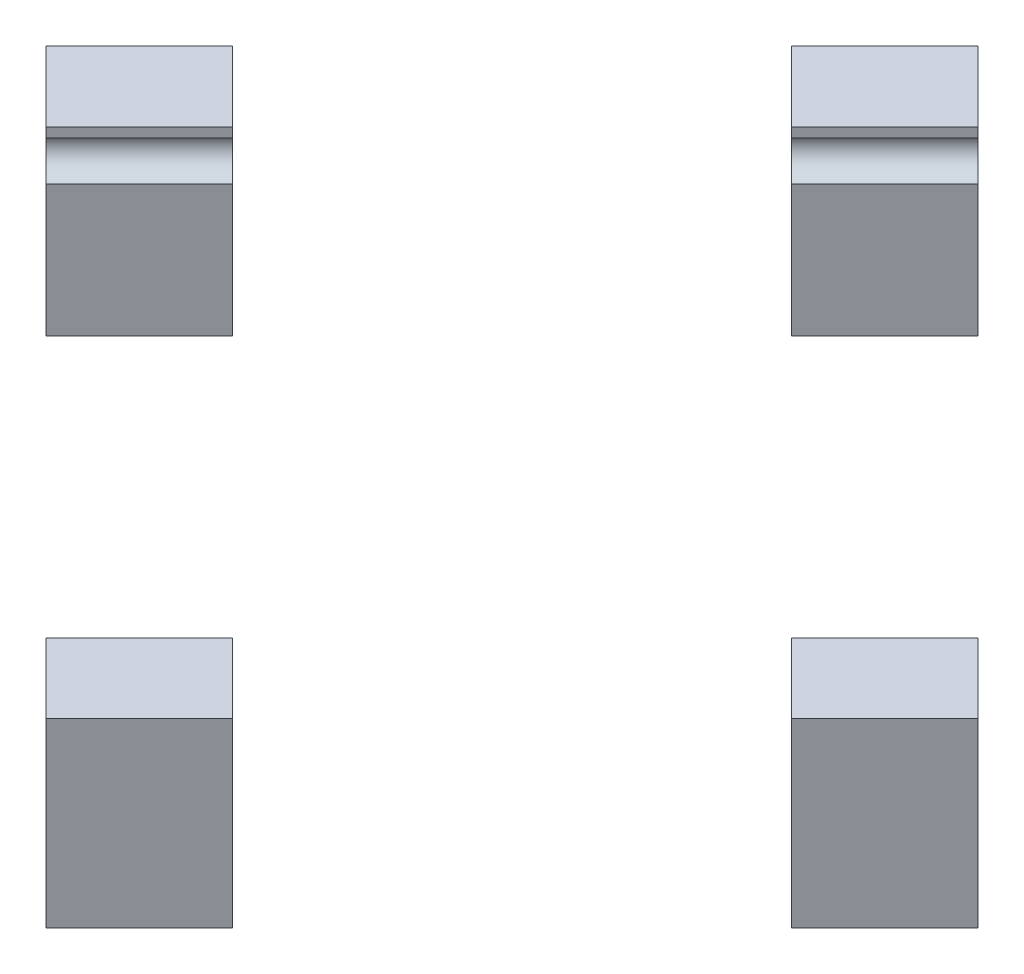
ISO-10303-21;
HEADER;
FILE_DESCRIPTION(('STEP AP214'),'2;1');
FILE_NAME('part.step','',(''),(''),'','','');
FILE_SCHEMA(('AUTOMOTIVE_DESIGN { 1 0 10303 214 1 1 1 1 }'));
ENDSEC;
DATA;
#1=APPLICATION_CONTEXT('core data for automotive mechanical design processes');
#2=APPLICATION_PROTOCOL_DEFINITION('international standard','automotive_design',2000,#1);
#3=PRODUCT_CONTEXT('',#1,'mechanical');
#4=PRODUCT('Part','Part','',(#3));
#5=PRODUCT_RELATED_PRODUCT_CATEGORY('part','',(#4));
#6=PRODUCT_DEFINITION_FORMATION('','',#4);
#7=PRODUCT_DEFINITION_CONTEXT('part definition',#1,'design');
#8=PRODUCT_DEFINITION('design','',#6,#7);
#9=PRODUCT_DEFINITION_SHAPE('','',#8);
#10=(LENGTH_UNIT() NAMED_UNIT(*) SI_UNIT(.MILLI.,.METRE.));
#11=(NAMED_UNIT(*) PLANE_ANGLE_UNIT() SI_UNIT($,.RADIAN.));
#12=(NAMED_UNIT(*) SI_UNIT($,.STERADIAN.) SOLID_ANGLE_UNIT());
#13=UNCERTAINTY_MEASURE_WITH_UNIT(LENGTH_MEASURE(1.E-05),#10,'distance_accuracy_value','');
#14=(GEOMETRIC_REPRESENTATION_CONTEXT(3) GLOBAL_UNCERTAINTY_ASSIGNED_CONTEXT((#13)) GLOBAL_UNIT_ASSIGNED_CONTEXT((#10,
#11,#12)) REPRESENTATION_CONTEXT('',''));
#15=CARTESIAN_POINT('',(0.,0.,0.));
#16=DIRECTION('',(0.,0.,1.));
#17=DIRECTION('',(1.,0.,0.));
#18=AXIS2_PLACEMENT_3D('',#15,#16,#17);
#19=CARTESIAN_POINT('',(-3.85003070092663,5.5,14.5745905015321));
#20=DIRECTION('',(0.707106781186547,0.,-0.707106781186548));
#21=DIRECTION('',(-0.707106781186548,0.,-0.707106781186547));
#22=AXIS2_PLACEMENT_3D('',#19,#20,#21);
#23=PLANE('',#22);
#24=CARTESIAN_POINT('',(-3.85003070092664,4.6,14.5745905015321));
#25=DIRECTION('',(0.707106781186547,0.,-0.707106781186548));
#26=DIRECTION('',(-0.707106781186548,0.,-0.707106781186547));
#27=AXIS2_PLACEMENT_3D('',#24,#25,#26);
#28=CIRCLE('',#27,0.6);
#29=CARTESIAN_POINT('',(-3.85003070092663,4.,14.5745905015321));
#30=VERTEX_POINT('',#29);
#31=CARTESIAN_POINT('',(-3.85003070092663,5.2,14.5745905015321));
#32=VERTEX_POINT('',#31);
#33=EDGE_CURVE('E107',#30,#32,#28,.F.);
#34=ORIENTED_EDGE('',*,*,#33,.F.);
#35=DIRECTION('',(0.,-1.,0.));
#36=VECTOR('',#35,1.);
#37=CARTESIAN_POINT('',(-3.85003070092663,5.5,14.5745905015321));
#38=LINE('',#37,#36);
#39=CARTESIAN_POINT('',(-3.85003070092663,0.,14.5745905015321));
#40=VERTEX_POINT('',#39);
#41=EDGE_CURVE('E94',#30,#40,#38,.T.);
#42=ORIENTED_EDGE('',*,*,#41,.T.);
#43=DIRECTION('',(0.707106781186548,0.,0.707106781186547));
#44=VECTOR('',#43,1.);
#45=CARTESIAN_POINT('',(-3.85003070092663,0.,14.5745905015321));
#46=LINE('',#45,#44);
#47=CARTESIAN_POINT('',(-1.72871035736698,0.,16.6959108450918));
#48=VERTEX_POINT('',#47);
#49=EDGE_CURVE('E111',#40,#48,#46,.T.);
#50=ORIENTED_EDGE('',*,*,#49,.T.);
#51=DIRECTION('',(0.,-1.,0.));
#52=VECTOR('',#51,1.);
#53=CARTESIAN_POINT('',(-1.72871035736698,5.5,16.6959108450918));
#54=LINE('',#53,#52);
#55=CARTESIAN_POINT('',(-1.72871035736698,5.5,16.6959108450918));
#56=VERTEX_POINT('',#55);
#57=EDGE_CURVE('E114',#56,#48,#54,.T.);
#58=ORIENTED_EDGE('',*,*,#57,.F.);
#59=DIRECTION('',(0.707106781186548,0.,0.707106781186547));
#60=VECTOR('',#59,1.);
#61=CARTESIAN_POINT('',(-3.85003070092663,5.5,14.5745905015321));
#62=LINE('',#61,#60);
#63=CARTESIAN_POINT('',(-3.85003070092663,5.5,14.5745905015321));
#64=VERTEX_POINT('',#63);
#65=EDGE_CURVE('E125',#64,#56,#62,.T.);
#66=ORIENTED_EDGE('',*,*,#65,.F.);
#67=EDGE_CURVE('E102',#64,#32,#38,.T.);
#68=ORIENTED_EDGE('',*,*,#67,.T.);
#69=EDGE_LOOP('',(#34,#42,#50,#58,#66,#68));
#70=FACE_BOUND('',#69,.T.);
#71=ADVANCED_FACE('F44',(#70),#23,.F.);
#72=CARTESIAN_POINT('',(1.09971676737921,5.5,13.8674837203456));
#73=DIRECTION('',(-0.707106781186547,0.,0.707106781186548));
#74=DIRECTION('',(0.707106781186548,0.,0.707106781186547));
#75=AXIS2_PLACEMENT_3D('',#72,#73,#74);
#76=PLANE('',#75);
#77=CARTESIAN_POINT('',(-1.02160357618043,4.6,11.7461633767859));
#78=DIRECTION('',(-0.707106781186547,0.,0.707106781186548));
#79=DIRECTION('',(0.707106781186548,0.,0.707106781186547));
#80=AXIS2_PLACEMENT_3D('',#77,#78,#79);
#81=CIRCLE('',#80,0.6);
#82=CARTESIAN_POINT('',(-1.02160357618044,5.2,11.7461633767859));
#83=VERTEX_POINT('',#82);
#84=CARTESIAN_POINT('',(-1.02160357618044,4.,11.7461633767859));
#85=VERTEX_POINT('',#84);
#86=EDGE_CURVE('E64',#83,#85,#81,.F.);
#87=ORIENTED_EDGE('',*,*,#86,.F.);
#88=DIRECTION('',(0.,-1.,0.));
#89=VECTOR('',#88,1.);
#90=CARTESIAN_POINT('',(-1.02160357618044,5.5,11.7461633767859));
#91=LINE('',#90,#89);
#92=CARTESIAN_POINT('',(-1.02160357618044,5.5,11.7461633767859));
#93=VERTEX_POINT('',#92);
#94=EDGE_CURVE('E121',#93,#83,#91,.T.);
#95=ORIENTED_EDGE('',*,*,#94,.F.);
#96=DIRECTION('',(-0.707106781186548,0.,-0.707106781186547));
#97=VECTOR('',#96,1.);
#98=CARTESIAN_POINT('',(1.09971676737921,5.5,13.8674837203456));
#99=LINE('',#98,#97);
#100=CARTESIAN_POINT('',(1.09971676737921,5.5,13.8674837203456));
#101=VERTEX_POINT('',#100);
#102=EDGE_CURVE('E133',#101,#93,#99,.T.);
#103=ORIENTED_EDGE('',*,*,#102,.F.);
#104=DIRECTION('',(0.,-1.,0.));
#105=VECTOR('',#104,1.);
#106=CARTESIAN_POINT('',(1.09971676737921,5.5,13.8674837203456));
#107=LINE('',#106,#105);
#108=CARTESIAN_POINT('',(1.09971676737921,0.,13.8674837203456));
#109=VERTEX_POINT('',#108);
#110=EDGE_CURVE('E116',#101,#109,#107,.T.);
#111=ORIENTED_EDGE('',*,*,#110,.T.);
#112=DIRECTION('',(-0.707106781186548,0.,-0.707106781186547));
#113=VECTOR('',#112,1.);
#114=CARTESIAN_POINT('',(1.09971676737921,0.,13.8674837203456));
#115=LINE('',#114,#113);
#116=CARTESIAN_POINT('',(-1.02160357618044,0.,11.7461633767859));
#117=VERTEX_POINT('',#116);
#118=EDGE_CURVE('E126',#109,#117,#115,.T.);
#119=ORIENTED_EDGE('',*,*,#118,.T.);
#120=EDGE_CURVE('E122',#85,#117,#91,.T.);
#121=ORIENTED_EDGE('',*,*,#120,.F.);
#122=EDGE_LOOP('',(#87,#95,#103,#111,#119,#121));
#123=FACE_BOUND('',#122,.T.);
#124=ADVANCED_FACE('F148',(#123),#76,.F.);
#125=CARTESIAN_POINT('',(-1.02160357618044,5.5,11.7461633767859));
#126=DIRECTION('',(0.707106781186548,0.,0.707106781186547));
#127=DIRECTION('',(0.707106781186547,0.,-0.707106781186548));
#128=AXIS2_PLACEMENT_3D('',#125,#126,#127);
#129=PLANE('',#128);
#130=DIRECTION('',(-0.707106781186548,0.,0.707106781186547));
#131=VECTOR('',#130,1.);
#132=CARTESIAN_POINT('',(68.0405126849987,5.2,-57.3159528843933));
#133=LINE('',#132,#131);
#134=EDGE_CURVE('E12',#32,#83,#133,.F.);
#135=ORIENTED_EDGE('',*,*,#134,.F.);
#136=ORIENTED_EDGE('',*,*,#67,.F.);
#137=DIRECTION('',(-0.707106781186547,0.,0.707106781186548));
#138=VECTOR('',#137,1.);
#139=CARTESIAN_POINT('',(-1.02160357618044,5.5,11.7461633767859));
#140=LINE('',#139,#138);
#141=EDGE_CURVE('E103',#93,#64,#140,.T.);
#142=ORIENTED_EDGE('',*,*,#141,.F.);
#143=ORIENTED_EDGE('',*,*,#94,.T.);
#144=EDGE_LOOP('',(#135,#136,#142,#143));
#145=FACE_BOUND('',#144,.T.);
#146=ADVANCED_FACE('F150',(#145),#129,.F.);
#147=DIRECTION('',(-0.707106781186548,0.,0.707106781186547));
#148=VECTOR('',#147,1.);
#149=CARTESIAN_POINT('',(68.0405126849987,4.,-57.3159528843933));
#150=LINE('',#149,#148);
#151=EDGE_CURVE('E51',#85,#30,#150,.T.);
#152=ORIENTED_EDGE('',*,*,#151,.F.);
#153=ORIENTED_EDGE('',*,*,#120,.T.);
#154=DIRECTION('',(-0.707106781186547,0.,0.707106781186548));
#155=VECTOR('',#154,1.);
#156=CARTESIAN_POINT('',(-1.02160357618044,0.,11.7461633767859));
#157=LINE('',#156,#155);
#158=EDGE_CURVE('E98',#117,#40,#157,.T.);
#159=ORIENTED_EDGE('',*,*,#158,.T.);
#160=ORIENTED_EDGE('',*,*,#41,.F.);
#161=EDGE_LOOP('',(#152,#153,#159,#160));
#162=FACE_BOUND('',#161,.T.);
#163=ADVANCED_FACE('F96',(#162),#129,.F.);
#164=CARTESIAN_POINT('',(-1.72871035736698,5.5,16.6959108450918));
#165=DIRECTION('',(-0.707106781186547,0.,-0.707106781186548));
#166=DIRECTION('',(-0.707106781186548,0.,0.707106781186547));
#167=AXIS2_PLACEMENT_3D('',#164,#165,#166);
#168=PLANE('',#167);
#169=DIRECTION('',(0.707106781186548,0.,-0.707106781186547));
#170=VECTOR('',#169,1.);
#171=CARTESIAN_POINT('',(-1.72871035736698,0.,16.6959108450918));
#172=LINE('',#171,#170);
#173=EDGE_CURVE('E129',#48,#109,#172,.T.);
#174=ORIENTED_EDGE('',*,*,#173,.T.);
#175=ORIENTED_EDGE('',*,*,#110,.F.);
#176=DIRECTION('',(0.707106781186548,0.,-0.707106781186547));
#177=VECTOR('',#176,1.);
#178=CARTESIAN_POINT('',(-1.72871035736698,5.5,16.6959108450918));
#179=LINE('',#178,#177);
#180=EDGE_CURVE('E135',#56,#101,#179,.T.);
#181=ORIENTED_EDGE('',*,*,#180,.F.);
#182=ORIENTED_EDGE('',*,*,#57,.T.);
#183=EDGE_LOOP('',(#174,#175,#181,#182));
#184=FACE_BOUND('',#183,.T.);
#185=ADVANCED_FACE('F145',(#184),#168,.F.);
#186=CARTESIAN_POINT('',(0.,5.5,0.));
#187=DIRECTION('',(0.,1.,0.));
#188=DIRECTION('',(0.,0.,1.));
#189=AXIS2_PLACEMENT_3D('',#186,#187,#188);
#190=PLANE('',#189);
#191=ORIENTED_EDGE('',*,*,#65,.T.);
#192=ORIENTED_EDGE('',*,*,#180,.T.);
#193=ORIENTED_EDGE('',*,*,#102,.T.);
#194=ORIENTED_EDGE('',*,*,#141,.T.);
#195=EDGE_LOOP('',(#191,#192,#193,#194));
#196=FACE_BOUND('',#195,.T.);
#197=ADVANCED_FACE('F141',(#196),#190,.T.);
#198=CARTESIAN_POINT('',(0.,0.,0.));
#199=DIRECTION('',(0.,1.,0.));
#200=DIRECTION('',(0.,0.,1.));
#201=AXIS2_PLACEMENT_3D('',#198,#199,#200);
#202=PLANE('',#201);
#203=ORIENTED_EDGE('',*,*,#49,.F.);
#204=ORIENTED_EDGE('',*,*,#158,.F.);
#205=ORIENTED_EDGE('',*,*,#118,.F.);
#206=ORIENTED_EDGE('',*,*,#173,.F.);
#207=EDGE_LOOP('',(#203,#204,#205,#206));
#208=FACE_BOUND('',#207,.T.);
#209=ADVANCED_FACE('F187',(#208),#202,.F.);
#210=CARTESIAN_POINT('',(68.0405126849988,4.6,-57.3159528843933));
#211=DIRECTION('',(-0.707106781186548,0.,0.707106781186547));
#212=DIRECTION('',(0.707106781186547,0.,0.707106781186548));
#213=AXIS2_PLACEMENT_3D('',#210,#211,#212);
#214=CYLINDRICAL_SURFACE('',#213,0.6);
#215=ORIENTED_EDGE('',*,*,#151,.T.);
#216=ORIENTED_EDGE('',*,*,#33,.T.);
#217=ORIENTED_EDGE('',*,*,#134,.T.);
#218=ORIENTED_EDGE('',*,*,#86,.T.);
#219=EDGE_LOOP('',(#215,#216,#217,#218));
#220=FACE_BOUND('',#219,.T.);
#221=ADVANCED_FACE('F113',(#220),#214,.F.);
#222=CLOSED_SHELL('',(#71,#124,#146,#163,#185,#197,#209,#221));
#223=MANIFOLD_SOLID_BREP('B2',#222);
#224=CARTESIAN_POINT('',(-17.285059543471,5.5,1.13956165898772));
#225=DIRECTION('',(-0.707106781186548,0.,-0.707106781186548));
#226=DIRECTION('',(-0.707106781186548,0.,0.707106781186548));
#227=AXIS2_PLACEMENT_3D('',#224,#225,#226);
#228=PLANE('',#227);
#229=DIRECTION('',(0.,-1.,0.));
#230=VECTOR('',#229,1.);
#231=CARTESIAN_POINT('',(-17.285059543471,5.5,1.13956165898772));
#232=LINE('',#231,#230);
#233=CARTESIAN_POINT('',(-17.285059543471,5.5,1.13956165898772));
#234=VERTEX_POINT('',#233);
#235=CARTESIAN_POINT('',(-17.285059543471,5.2,1.13956165898773));
#236=VERTEX_POINT('',#235);
#237=EDGE_CURVE('E235',#234,#236,#232,.T.);
#238=ORIENTED_EDGE('',*,*,#237,.T.);
#239=DIRECTION('',(0.707106781186547,0.,-0.707106781186548));
#240=VECTOR('',#239,1.);
#241=CARTESIAN_POINT('',(-26.1238943083029,5.2,9.97839642381958));
#242=LINE('',#241,#240);
#243=CARTESIAN_POINT('',(-14.4566324187248,5.2,-1.68886546575846));
#244=VERTEX_POINT('',#243);
#245=EDGE_CURVE('E287',#236,#244,#242,.T.);
#246=ORIENTED_EDGE('',*,*,#245,.T.);
#247=DIRECTION('',(0.,-1.,0.));
#248=VECTOR('',#247,1.);
#249=CARTESIAN_POINT('',(-14.4566324187248,5.5,-1.68886546575847));
#250=LINE('',#249,#248);
#251=CARTESIAN_POINT('',(-14.4566324187248,5.5,-1.68886546575847));
#252=VERTEX_POINT('',#251);
#253=EDGE_CURVE('E301',#252,#244,#250,.T.);
#254=ORIENTED_EDGE('',*,*,#253,.F.);
#255=DIRECTION('',(0.707106781186547,0.,-0.707106781186547));
#256=VECTOR('',#255,1.);
#257=CARTESIAN_POINT('',(-17.285059543471,5.5,1.13956165898772));
#258=LINE('',#257,#256);
#259=EDGE_CURVE('E279',#234,#252,#258,.T.);
#260=ORIENTED_EDGE('',*,*,#259,.F.);
#261=EDGE_LOOP('',(#238,#246,#254,#260));
#262=FACE_BOUND('',#261,.T.);
#263=ADVANCED_FACE('F227',(#262),#228,.F.);
#264=CARTESIAN_POINT('',(-19.4063798870307,5.5,-0.981758684571922));
#265=DIRECTION('',(0.707106781186548,0.,-0.707106781186547));
#266=DIRECTION('',(-0.707106781186547,0.,-0.707106781186548));
#267=AXIS2_PLACEMENT_3D('',#264,#265,#266);
#268=PLANE('',#267);
#269=CARTESIAN_POINT('',(-17.285059543471,4.,1.13956165898773));
#270=VERTEX_POINT('',#269);
#271=CARTESIAN_POINT('',(-17.285059543471,0.,1.13956165898772));
#272=VERTEX_POINT('',#271);
#273=EDGE_CURVE('E298',#270,#272,#232,.T.);
#274=ORIENTED_EDGE('',*,*,#273,.F.);
#275=CARTESIAN_POINT('',(-17.285059543471,4.6,1.13956165898773));
#276=DIRECTION('',(0.707106781186548,0.,-0.707106781186547));
#277=DIRECTION('',(-0.707106781186547,0.,-0.707106781186548));
#278=AXIS2_PLACEMENT_3D('',#275,#276,#277);
#279=CIRCLE('',#278,0.6);
#280=EDGE_CURVE('E290',#270,#236,#279,.T.);
#281=ORIENTED_EDGE('',*,*,#280,.T.);
#282=ORIENTED_EDGE('',*,*,#237,.F.);
#283=DIRECTION('',(0.707106781186547,0.,0.707106781186548));
#284=VECTOR('',#283,1.);
#285=CARTESIAN_POINT('',(-19.4063798870307,5.5,-0.981758684571922));
#286=LINE('',#285,#284);
#287=CARTESIAN_POINT('',(-19.4063798870307,5.5,-0.981758684571922));
#288=VERTEX_POINT('',#287);
#289=EDGE_CURVE('E310',#288,#234,#286,.T.);
#290=ORIENTED_EDGE('',*,*,#289,.F.);
#291=DIRECTION('',(0.,-1.,0.));
#292=VECTOR('',#291,1.);
#293=CARTESIAN_POINT('',(-19.4063798870307,5.5,-0.981758684571922));
#294=LINE('',#293,#292);
#295=CARTESIAN_POINT('',(-19.4063798870307,0.,-0.981758684571922));
#296=VERTEX_POINT('',#295);
#297=EDGE_CURVE('E307',#288,#296,#294,.T.);
#298=ORIENTED_EDGE('',*,*,#297,.T.);
#299=DIRECTION('',(0.707106781186547,0.,0.707106781186548));
#300=VECTOR('',#299,1.);
#301=CARTESIAN_POINT('',(-19.4063798870307,0.,-0.981758684571922));
#302=LINE('',#301,#300);
#303=EDGE_CURVE('E299',#296,#272,#302,.T.);
#304=ORIENTED_EDGE('',*,*,#303,.T.);
#305=EDGE_LOOP('',(#274,#281,#282,#290,#298,#304));
#306=FACE_BOUND('',#305,.T.);
#307=ADVANCED_FACE('F229',(#306),#268,.F.);
#308=CARTESIAN_POINT('',(-14.4566324187248,4.,-1.68886546575847));
#309=VERTEX_POINT('',#308);
#310=CARTESIAN_POINT('',(-14.4566324187248,0.,-1.68886546575847));
#311=VERTEX_POINT('',#310);
#312=EDGE_CURVE('E304',#309,#311,#250,.T.);
#313=ORIENTED_EDGE('',*,*,#312,.F.);
#314=DIRECTION('',(0.707106781186547,0.,-0.707106781186548));
#315=VECTOR('',#314,1.);
#316=CARTESIAN_POINT('',(-26.1238943083029,4.,9.97839642381957));
#317=LINE('',#316,#315);
#318=EDGE_CURVE('E242',#270,#309,#317,.T.);
#319=ORIENTED_EDGE('',*,*,#318,.F.);
#320=ORIENTED_EDGE('',*,*,#273,.T.);
#321=DIRECTION('',(0.707106781186547,0.,-0.707106781186547));
#322=VECTOR('',#321,1.);
#323=CARTESIAN_POINT('',(-17.285059543471,0.,1.13956165898772));
#324=LINE('',#323,#322);
#325=EDGE_CURVE('E313',#272,#311,#324,.T.);
#326=ORIENTED_EDGE('',*,*,#325,.T.);
#327=EDGE_LOOP('',(#313,#319,#320,#326));
#328=FACE_BOUND('',#327,.T.);
#329=ADVANCED_FACE('F330',(#328),#228,.F.);
#330=CARTESIAN_POINT('',(-14.4566324187248,5.5,-1.68886546575847));
#331=DIRECTION('',(-0.707106781186548,0.,0.707106781186547));
#332=DIRECTION('',(0.707106781186547,0.,0.707106781186548));
#333=AXIS2_PLACEMENT_3D('',#330,#331,#332);
#334=PLANE('',#333);
#335=ORIENTED_EDGE('',*,*,#253,.T.);
#336=CARTESIAN_POINT('',(-14.4566324187248,4.6,-1.68886546575846));
#337=DIRECTION('',(-0.707106781186548,0.,0.707106781186547));
#338=DIRECTION('',(0.707106781186547,0.,0.707106781186548));
#339=AXIS2_PLACEMENT_3D('',#336,#337,#338);
#340=CIRCLE('',#339,0.6);
#341=EDGE_CURVE('E42',#244,#309,#340,.T.);
#342=ORIENTED_EDGE('',*,*,#341,.T.);
#343=ORIENTED_EDGE('',*,*,#312,.T.);
#344=DIRECTION('',(-0.707106781186547,0.,-0.707106781186548));
#345=VECTOR('',#344,1.);
#346=CARTESIAN_POINT('',(-14.4566324187248,0.,-1.68886546575847));
#347=LINE('',#346,#345);
#348=CARTESIAN_POINT('',(-16.5779527622845,0.,-3.81018580931811));
#349=VERTEX_POINT('',#348);
#350=EDGE_CURVE('E311',#311,#349,#347,.T.);
#351=ORIENTED_EDGE('',*,*,#350,.T.);
#352=DIRECTION('',(0.,-1.,0.));
#353=VECTOR('',#352,1.);
#354=CARTESIAN_POINT('',(-16.5779527622845,5.5,-3.81018580931811));
#355=LINE('',#354,#353);
#356=CARTESIAN_POINT('',(-16.5779527622845,5.5,-3.81018580931811));
#357=VERTEX_POINT('',#356);
#358=EDGE_CURVE('E305',#357,#349,#355,.T.);
#359=ORIENTED_EDGE('',*,*,#358,.F.);
#360=DIRECTION('',(-0.707106781186547,0.,-0.707106781186548));
#361=VECTOR('',#360,1.);
#362=CARTESIAN_POINT('',(-14.4566324187248,5.5,-1.68886546575847));
#363=LINE('',#362,#361);
#364=EDGE_CURVE('E318',#252,#357,#363,.T.);
#365=ORIENTED_EDGE('',*,*,#364,.F.);
#366=EDGE_LOOP('',(#335,#342,#343,#351,#359,#365));
#367=FACE_BOUND('',#366,.T.);
#368=ADVANCED_FACE('F332',(#367),#334,.F.);
#369=CARTESIAN_POINT('',(-16.5779527622845,5.5,-3.81018580931811));
#370=DIRECTION('',(0.707106781186547,0.,0.707106781186548));
#371=DIRECTION('',(0.707106781186548,0.,-0.707106781186547));
#372=AXIS2_PLACEMENT_3D('',#369,#370,#371);
#373=PLANE('',#372);
#374=DIRECTION('',(-0.707106781186548,0.,0.707106781186547));
#375=VECTOR('',#374,1.);
#376=CARTESIAN_POINT('',(-16.5779527622845,0.,-3.81018580931811));
#377=LINE('',#376,#375);
#378=EDGE_CURVE('E271',#349,#296,#377,.T.);
#379=ORIENTED_EDGE('',*,*,#378,.T.);
#380=ORIENTED_EDGE('',*,*,#297,.F.);
#381=DIRECTION('',(-0.707106781186548,0.,0.707106781186547));
#382=VECTOR('',#381,1.);
#383=CARTESIAN_POINT('',(-16.5779527622845,5.5,-3.81018580931811));
#384=LINE('',#383,#382);
#385=EDGE_CURVE('E250',#357,#288,#384,.T.);
#386=ORIENTED_EDGE('',*,*,#385,.F.);
#387=ORIENTED_EDGE('',*,*,#358,.T.);
#388=EDGE_LOOP('',(#379,#380,#386,#387));
#389=FACE_BOUND('',#388,.T.);
#390=ADVANCED_FACE('F335',(#389),#373,.F.);
#391=CARTESIAN_POINT('',(0.,5.5,0.));
#392=DIRECTION('',(0.,1.,0.));
#393=DIRECTION('',(0.,0.,1.));
#394=AXIS2_PLACEMENT_3D('',#391,#392,#393);
#395=PLANE('',#394);
#396=ORIENTED_EDGE('',*,*,#289,.T.);
#397=ORIENTED_EDGE('',*,*,#259,.T.);
#398=ORIENTED_EDGE('',*,*,#364,.T.);
#399=ORIENTED_EDGE('',*,*,#385,.T.);
#400=EDGE_LOOP('',(#396,#397,#398,#399));
#401=FACE_BOUND('',#400,.T.);
#402=ADVANCED_FACE('F322',(#401),#395,.T.);
#403=CARTESIAN_POINT('',(0.,0.,0.));
#404=DIRECTION('',(0.,1.,0.));
#405=DIRECTION('',(0.,0.,1.));
#406=AXIS2_PLACEMENT_3D('',#403,#404,#405);
#407=PLANE('',#406);
#408=ORIENTED_EDGE('',*,*,#303,.F.);
#409=ORIENTED_EDGE('',*,*,#378,.F.);
#410=ORIENTED_EDGE('',*,*,#350,.F.);
#411=ORIENTED_EDGE('',*,*,#325,.F.);
#412=EDGE_LOOP('',(#408,#409,#410,#411));
#413=FACE_BOUND('',#412,.T.);
#414=ADVANCED_FACE('F326',(#413),#407,.F.);
#415=CARTESIAN_POINT('',(-26.1238943083029,4.6,9.97839642381958));
#416=DIRECTION('',(0.707106781186547,0.,-0.707106781186548));
#417=DIRECTION('',(-0.707106781186548,0.,-0.707106781186547));
#418=AXIS2_PLACEMENT_3D('',#415,#416,#417);
#419=CYLINDRICAL_SURFACE('',#418,0.6);
#420=ORIENTED_EDGE('',*,*,#318,.T.);
#421=ORIENTED_EDGE('',*,*,#341,.F.);
#422=ORIENTED_EDGE('',*,*,#245,.F.);
#423=ORIENTED_EDGE('',*,*,#280,.F.);
#424=EDGE_LOOP('',(#420,#421,#422,#423));
#425=FACE_BOUND('',#424,.T.);
#426=ADVANCED_FACE('F289',(#425),#419,.F.);
#427=CLOSED_SHELL('',(#263,#307,#329,#368,#390,#402,#414,#426));
#428=MANIFOLD_SOLID_BREP('B6',#427);
#429=CARTESIAN_POINT('',(-5.97135104448627,5.5,-10.174146839997));
#430=DIRECTION('',(-0.707106781186548,0.,-0.707106781186547));
#431=DIRECTION('',(-0.707106781186547,0.,0.707106781186548));
#432=AXIS2_PLACEMENT_3D('',#429,#430,#431);
#433=PLANE('',#432);
#434=DIRECTION('',(0.,-1.,0.));
#435=VECTOR('',#434,1.);
#436=CARTESIAN_POINT('',(-5.97135104448627,5.5,-10.174146839997));
#437=LINE('',#436,#435);
#438=CARTESIAN_POINT('',(-5.97135104448627,5.5,-10.174146839997));
#439=VERTEX_POINT('',#438);
#440=CARTESIAN_POINT('',(-5.97135104448627,5.2,-10.174146839997));
#441=VERTEX_POINT('',#440);
#442=EDGE_CURVE('E225',#439,#441,#437,.T.);
#443=ORIENTED_EDGE('',*,*,#442,.T.);
#444=DIRECTION('',(0.707106781186547,0.,-0.707106781186548));
#445=VECTOR('',#444,1.);
#446=CARTESIAN_POINT('',(-26.1238943083029,5.2,9.97839642381958));
#447=LINE('',#446,#445);
#448=CARTESIAN_POINT('',(-3.14292391974008,5.2,-13.0025739647432));
#449=VERTEX_POINT('',#448);
#450=EDGE_CURVE('E471',#441,#449,#447,.T.);
#451=ORIENTED_EDGE('',*,*,#450,.T.);
#452=DIRECTION('',(0.,-1.,0.));
#453=VECTOR('',#452,1.);
#454=CARTESIAN_POINT('',(-3.14292391974008,5.5,-13.0025739647432));
#455=LINE('',#454,#453);
#456=CARTESIAN_POINT('',(-3.14292391974008,5.5,-13.0025739647432));
#457=VERTEX_POINT('',#456);
#458=EDGE_CURVE('E477',#457,#449,#455,.T.);
#459=ORIENTED_EDGE('',*,*,#458,.F.);
#460=DIRECTION('',(0.707106781186547,0.,-0.707106781186548));
#461=VECTOR('',#460,1.);
#462=CARTESIAN_POINT('',(-5.97135104448627,5.5,-10.174146839997));
#463=LINE('',#462,#461);
#464=EDGE_CURVE('E461',#439,#457,#463,.T.);
#465=ORIENTED_EDGE('',*,*,#464,.F.);
#466=EDGE_LOOP('',(#443,#451,#459,#465));
#467=FACE_BOUND('',#466,.T.);
#468=ADVANCED_FACE('F409',(#467),#433,.F.);
#469=CARTESIAN_POINT('',(-8.09267138804591,5.5,-12.2954671835567));
#470=DIRECTION('',(0.707106781186547,0.,-0.707106781186548));
#471=DIRECTION('',(-0.707106781186548,0.,-0.707106781186547));
#472=AXIS2_PLACEMENT_3D('',#469,#470,#471);
#473=PLANE('',#472);
#474=CARTESIAN_POINT('',(-5.97135104448628,4.,-10.174146839997));
#475=VERTEX_POINT('',#474);
#476=CARTESIAN_POINT('',(-5.97135104448627,0.,-10.174146839997));
#477=VERTEX_POINT('',#476);
#478=EDGE_CURVE('E417',#475,#477,#437,.T.);
#479=ORIENTED_EDGE('',*,*,#478,.F.);
#480=CARTESIAN_POINT('',(-5.97135104448626,4.6,-10.174146839997));
#481=DIRECTION('',(0.707106781186547,0.,-0.707106781186548));
#482=DIRECTION('',(-0.707106781186548,0.,-0.707106781186547));
#483=AXIS2_PLACEMENT_3D('',#480,#481,#482);
#484=CIRCLE('',#483,0.6);
#485=EDGE_CURVE('E500',#475,#441,#484,.T.);
#486=ORIENTED_EDGE('',*,*,#485,.T.);
#487=ORIENTED_EDGE('',*,*,#442,.F.);
#488=DIRECTION('',(0.707106781186548,0.,0.707106781186547));
#489=VECTOR('',#488,1.);
#490=CARTESIAN_POINT('',(-8.09267138804591,5.5,-12.2954671835567));
#491=LINE('',#490,#489);
#492=CARTESIAN_POINT('',(-8.09267138804591,5.5,-12.2954671835567));
#493=VERTEX_POINT('',#492);
#494=EDGE_CURVE('E491',#493,#439,#491,.T.);
#495=ORIENTED_EDGE('',*,*,#494,.F.);
#496=DIRECTION('',(0.,-1.,0.));
#497=VECTOR('',#496,1.);
#498=CARTESIAN_POINT('',(-8.09267138804591,5.5,-12.2954671835567));
#499=LINE('',#498,#497);
#500=CARTESIAN_POINT('',(-8.09267138804591,0.,-12.2954671835567));
#501=VERTEX_POINT('',#500);
#502=EDGE_CURVE('E488',#493,#501,#499,.T.);
#503=ORIENTED_EDGE('',*,*,#502,.T.);
#504=DIRECTION('',(0.707106781186548,0.,0.707106781186547));
#505=VECTOR('',#504,1.);
#506=CARTESIAN_POINT('',(-8.09267138804591,0.,-12.2954671835567));
#507=LINE('',#506,#505);
#508=EDGE_CURVE('E497',#501,#477,#507,.T.);
#509=ORIENTED_EDGE('',*,*,#508,.T.);
#510=EDGE_LOOP('',(#479,#486,#487,#495,#503,#509));
#511=FACE_BOUND('',#510,.T.);
#512=ADVANCED_FACE('F411',(#511),#473,.F.);
#513=CARTESIAN_POINT('',(-3.14292391974008,4.,-13.0025739647432));
#514=VERTEX_POINT('',#513);
#515=CARTESIAN_POINT('',(-3.14292391974008,0.,-13.0025739647432));
#516=VERTEX_POINT('',#515);
#517=EDGE_CURVE('E484',#514,#516,#455,.T.);
#518=ORIENTED_EDGE('',*,*,#517,.F.);
#519=DIRECTION('',(0.707106781186547,0.,-0.707106781186548));
#520=VECTOR('',#519,1.);
#521=CARTESIAN_POINT('',(-26.1238943083029,4.,9.97839642381957));
#522=LINE('',#521,#520);
#523=EDGE_CURVE('E424',#475,#514,#522,.T.);
#524=ORIENTED_EDGE('',*,*,#523,.F.);
#525=ORIENTED_EDGE('',*,*,#478,.T.);
#526=DIRECTION('',(0.707106781186547,0.,-0.707106781186548));
#527=VECTOR('',#526,1.);
#528=CARTESIAN_POINT('',(-5.97135104448627,0.,-10.174146839997));
#529=LINE('',#528,#527);
#530=EDGE_CURVE('E494',#477,#516,#529,.T.);
#531=ORIENTED_EDGE('',*,*,#530,.T.);
#532=EDGE_LOOP('',(#518,#524,#525,#531));
#533=FACE_BOUND('',#532,.T.);
#534=ADVANCED_FACE('F510',(#533),#433,.F.);
#535=CARTESIAN_POINT('',(-3.14292391974008,5.5,-13.0025739647432));
#536=DIRECTION('',(-0.707106781186548,0.,0.707106781186548));
#537=DIRECTION('',(0.707106781186548,0.,0.707106781186548));
#538=AXIS2_PLACEMENT_3D('',#535,#536,#537);
#539=PLANE('',#538);
#540=ORIENTED_EDGE('',*,*,#458,.T.);
#541=CARTESIAN_POINT('',(-3.14292391974008,4.6,-13.0025739647432));
#542=DIRECTION('',(0.707106781186547,0.,-0.707106781186548));
#543=DIRECTION('',(0.707106781186548,0.,0.707106781186547));
#544=AXIS2_PLACEMENT_3D('',#541,#542,#543);
#545=CIRCLE('',#544,0.6);
#546=EDGE_CURVE('E468',#514,#449,#545,.T.);
#547=ORIENTED_EDGE('',*,*,#546,.F.);
#548=ORIENTED_EDGE('',*,*,#517,.T.);
#549=DIRECTION('',(-0.707106781186548,0.,-0.707106781186548));
#550=VECTOR('',#549,1.);
#551=CARTESIAN_POINT('',(-3.14292391974008,0.,-13.0025739647432));
#552=LINE('',#551,#550);
#553=CARTESIAN_POINT('',(-5.26424426329972,0.,-15.1238943083029));
#554=VERTEX_POINT('',#553);
#555=EDGE_CURVE('E492',#516,#554,#552,.T.);
#556=ORIENTED_EDGE('',*,*,#555,.T.);
#557=DIRECTION('',(0.,-1.,0.));
#558=VECTOR('',#557,1.);
#559=CARTESIAN_POINT('',(-5.26424426329972,5.5,-15.1238943083029));
#560=LINE('',#559,#558);
#561=CARTESIAN_POINT('',(-5.26424426329972,5.5,-15.1238943083029));
#562=VERTEX_POINT('',#561);
#563=EDGE_CURVE('E485',#562,#554,#560,.T.);
#564=ORIENTED_EDGE('',*,*,#563,.F.);
#565=DIRECTION('',(-0.707106781186548,0.,-0.707106781186548));
#566=VECTOR('',#565,1.);
#567=CARTESIAN_POINT('',(-3.14292391974008,5.5,-13.0025739647432));
#568=LINE('',#567,#566);
#569=EDGE_CURVE('E483',#457,#562,#568,.T.);
#570=ORIENTED_EDGE('',*,*,#569,.F.);
#571=EDGE_LOOP('',(#540,#547,#548,#556,#564,#570));
#572=FACE_BOUND('',#571,.T.);
#573=ADVANCED_FACE('F481',(#572),#539,.F.);
#574=CARTESIAN_POINT('',(-5.26424426329972,5.5,-15.1238943083029));
#575=DIRECTION('',(0.707106781186548,0.,0.707106781186548));
#576=DIRECTION('',(0.707106781186548,0.,-0.707106781186548));
#577=AXIS2_PLACEMENT_3D('',#574,#575,#576);
#578=PLANE('',#577);
#579=DIRECTION('',(-0.707106781186547,0.,0.707106781186547));
#580=VECTOR('',#579,1.);
#581=CARTESIAN_POINT('',(-5.26424426329972,0.,-15.1238943083029));
#582=LINE('',#581,#580);
#583=EDGE_CURVE('E454',#554,#501,#582,.T.);
#584=ORIENTED_EDGE('',*,*,#583,.T.);
#585=ORIENTED_EDGE('',*,*,#502,.F.);
#586=DIRECTION('',(-0.707106781186547,0.,0.707106781186547));
#587=VECTOR('',#586,1.);
#588=CARTESIAN_POINT('',(-5.26424426329972,5.5,-15.1238943083029));
#589=LINE('',#588,#587);
#590=EDGE_CURVE('E433',#562,#493,#589,.T.);
#591=ORIENTED_EDGE('',*,*,#590,.F.);
#592=ORIENTED_EDGE('',*,*,#563,.T.);
#593=EDGE_LOOP('',(#584,#585,#591,#592));
#594=FACE_BOUND('',#593,.T.);
#595=ADVANCED_FACE('F514',(#594),#578,.F.);
#596=CARTESIAN_POINT('',(0.,5.5,0.));
#597=DIRECTION('',(0.,1.,0.));
#598=DIRECTION('',(0.,0.,1.));
#599=AXIS2_PLACEMENT_3D('',#596,#597,#598);
#600=PLANE('',#599);
#601=ORIENTED_EDGE('',*,*,#494,.T.);
#602=ORIENTED_EDGE('',*,*,#464,.T.);
#603=ORIENTED_EDGE('',*,*,#569,.T.);
#604=ORIENTED_EDGE('',*,*,#590,.T.);
#605=EDGE_LOOP('',(#601,#602,#603,#604));
#606=FACE_BOUND('',#605,.T.);
#607=ADVANCED_FACE('F517',(#606),#600,.T.);
#608=CARTESIAN_POINT('',(0.,0.,0.));
#609=DIRECTION('',(0.,1.,0.));
#610=DIRECTION('',(0.,0.,1.));
#611=AXIS2_PLACEMENT_3D('',#608,#609,#610);
#612=PLANE('',#611);
#613=ORIENTED_EDGE('',*,*,#508,.F.);
#614=ORIENTED_EDGE('',*,*,#583,.F.);
#615=ORIENTED_EDGE('',*,*,#555,.F.);
#616=ORIENTED_EDGE('',*,*,#530,.F.);
#617=EDGE_LOOP('',(#613,#614,#615,#616));
#618=FACE_BOUND('',#617,.T.);
#619=ADVANCED_FACE('F516',(#618),#612,.F.);
#620=CARTESIAN_POINT('',(-26.1238943083029,4.6,9.97839642381958));
#621=DIRECTION('',(0.707106781186547,0.,-0.707106781186548));
#622=DIRECTION('',(-0.707106781186548,0.,-0.707106781186547));
#623=AXIS2_PLACEMENT_3D('',#620,#621,#622);
#624=CYLINDRICAL_SURFACE('',#623,0.6);
#625=ORIENTED_EDGE('',*,*,#523,.T.);
#626=ORIENTED_EDGE('',*,*,#546,.T.);
#627=ORIENTED_EDGE('',*,*,#450,.F.);
#628=ORIENTED_EDGE('',*,*,#485,.F.);
#629=EDGE_LOOP('',(#625,#626,#627,#628));
#630=FACE_BOUND('',#629,.T.);
#631=ADVANCED_FACE('F470',(#630),#624,.F.);
#632=CLOSED_SHELL('',(#468,#512,#534,#573,#595,#607,#619,#631));
#633=MANIFOLD_SOLID_BREP('B36',#632);
#634=CARTESIAN_POINT('',(9.58499814161778,5.5,5.382202346107));
#635=DIRECTION('',(0.707106781186548,0.,-0.707106781186547));
#636=DIRECTION('',(-0.707106781186547,0.,-0.707106781186548));
#637=AXIS2_PLACEMENT_3D('',#634,#635,#636);
#638=PLANE('',#637);
#639=CARTESIAN_POINT('',(7.46367779805814,4.6,3.26088200254734));
#640=DIRECTION('',(0.707106781186548,0.,-0.707106781186547));
#641=DIRECTION('',(-0.707106781186547,0.,-0.707106781186548));
#642=AXIS2_PLACEMENT_3D('',#639,#640,#641);
#643=CIRCLE('',#642,0.6);
#644=CARTESIAN_POINT('',(7.46367779805814,4.,3.26088200254734));
#645=VERTEX_POINT('',#644);
#646=CARTESIAN_POINT('',(7.46367779805814,5.2,3.26088200254736));
#647=VERTEX_POINT('',#646);
#648=EDGE_CURVE('E645',#645,#647,#643,.F.);
#649=ORIENTED_EDGE('',*,*,#648,.F.);
#650=DIRECTION('',(0.,-1.,0.));
#651=VECTOR('',#650,1.);
#652=CARTESIAN_POINT('',(7.46367779805814,5.5,3.26088200254736));
#653=LINE('',#652,#651);
#654=CARTESIAN_POINT('',(7.46367779805814,0.,3.26088200254736));
#655=VERTEX_POINT('',#654);
#656=EDGE_CURVE('E632',#645,#655,#653,.T.);
#657=ORIENTED_EDGE('',*,*,#656,.T.);
#658=DIRECTION('',(0.707106781186547,0.,0.707106781186548));
#659=VECTOR('',#658,1.);
#660=CARTESIAN_POINT('',(9.58499814161778,0.,5.382202346107));
#661=LINE('',#660,#659);
#662=CARTESIAN_POINT('',(9.58499814161778,0.,5.382202346107));
#663=VERTEX_POINT('',#662);
#664=EDGE_CURVE('E649',#655,#663,#661,.T.);
#665=ORIENTED_EDGE('',*,*,#664,.T.);
#666=DIRECTION('',(0.,-1.,0.));
#667=VECTOR('',#666,1.);
#668=CARTESIAN_POINT('',(9.58499814161778,5.5,5.382202346107));
#669=LINE('',#668,#667);
#670=CARTESIAN_POINT('',(9.58499814161778,5.5,5.382202346107));
#671=VERTEX_POINT('',#670);
#672=EDGE_CURVE('E652',#671,#663,#669,.T.);
#673=ORIENTED_EDGE('',*,*,#672,.F.);
#674=DIRECTION('',(0.707106781186547,0.,0.707106781186548));
#675=VECTOR('',#674,1.);
#676=CARTESIAN_POINT('',(9.58499814161778,5.5,5.382202346107));
#677=LINE('',#676,#675);
#678=CARTESIAN_POINT('',(7.46367779805814,5.5,3.26088200254736));
#679=VERTEX_POINT('',#678);
#680=EDGE_CURVE('E663',#679,#671,#677,.T.);
#681=ORIENTED_EDGE('',*,*,#680,.F.);
#682=EDGE_CURVE('E640',#679,#647,#653,.T.);
#683=ORIENTED_EDGE('',*,*,#682,.T.);
#684=EDGE_LOOP('',(#649,#657,#665,#673,#681,#683));
#685=FACE_BOUND('',#684,.T.);
#686=ADVANCED_FACE('F582',(#685),#638,.F.);
#687=CARTESIAN_POINT('',(12.413425266364,5.5,2.55377522136081));
#688=DIRECTION('',(-0.707106781186547,0.,0.707106781186548));
#689=DIRECTION('',(0.707106781186548,0.,0.707106781186547));
#690=AXIS2_PLACEMENT_3D('',#687,#688,#689);
#691=PLANE('',#690);
#692=CARTESIAN_POINT('',(10.2921049228043,4.6,0.432454877801164));
#693=DIRECTION('',(-0.707106781186547,0.,0.707106781186548));
#694=DIRECTION('',(0.707106781186548,0.,0.707106781186547));
#695=AXIS2_PLACEMENT_3D('',#692,#693,#694);
#696=CIRCLE('',#695,0.6);
#697=CARTESIAN_POINT('',(10.2921049228043,5.2,0.432454877801166));
#698=VERTEX_POINT('',#697);
#699=CARTESIAN_POINT('',(10.2921049228043,4.,0.432454877801166));
#700=VERTEX_POINT('',#699);
#701=EDGE_CURVE('E602',#698,#700,#696,.F.);
#702=ORIENTED_EDGE('',*,*,#701,.F.);
#703=DIRECTION('',(0.,-1.,0.));
#704=VECTOR('',#703,1.);
#705=CARTESIAN_POINT('',(10.2921049228043,5.5,0.432454877801166));
#706=LINE('',#705,#704);
#707=CARTESIAN_POINT('',(10.2921049228043,5.5,0.432454877801166));
#708=VERTEX_POINT('',#707);
#709=EDGE_CURVE('E659',#708,#698,#706,.T.);
#710=ORIENTED_EDGE('',*,*,#709,.F.);
#711=DIRECTION('',(-0.707106781186548,0.,-0.707106781186547));
#712=VECTOR('',#711,1.);
#713=CARTESIAN_POINT('',(12.413425266364,5.5,2.55377522136081));
#714=LINE('',#713,#712);
#715=CARTESIAN_POINT('',(12.413425266364,5.5,2.55377522136081));
#716=VERTEX_POINT('',#715);
#717=EDGE_CURVE('E671',#716,#708,#714,.T.);
#718=ORIENTED_EDGE('',*,*,#717,.F.);
#719=DIRECTION('',(0.,-1.,0.));
#720=VECTOR('',#719,1.);
#721=CARTESIAN_POINT('',(12.413425266364,5.5,2.55377522136081));
#722=LINE('',#721,#720);
#723=CARTESIAN_POINT('',(12.413425266364,0.,2.55377522136081));
#724=VERTEX_POINT('',#723);
#725=EDGE_CURVE('E654',#716,#724,#722,.T.);
#726=ORIENTED_EDGE('',*,*,#725,.T.);
#727=DIRECTION('',(-0.707106781186548,0.,-0.707106781186547));
#728=VECTOR('',#727,1.);
#729=CARTESIAN_POINT('',(12.413425266364,0.,2.55377522136081));
#730=LINE('',#729,#728);
#731=CARTESIAN_POINT('',(10.2921049228043,0.,0.432454877801166));
#732=VERTEX_POINT('',#731);
#733=EDGE_CURVE('E664',#724,#732,#730,.T.);
#734=ORIENTED_EDGE('',*,*,#733,.T.);
#735=EDGE_CURVE('E660',#700,#732,#706,.T.);
#736=ORIENTED_EDGE('',*,*,#735,.F.);
#737=EDGE_LOOP('',(#702,#710,#718,#726,#734,#736));
#738=FACE_BOUND('',#737,.T.);
#739=ADVANCED_FACE('F686',(#738),#691,.F.);
#740=CARTESIAN_POINT('',(10.2921049228043,5.5,0.432454877801166));
#741=DIRECTION('',(0.707106781186548,0.,0.707106781186548));
#742=DIRECTION('',(0.707106781186548,0.,-0.707106781186548));
#743=AXIS2_PLACEMENT_3D('',#740,#741,#742);
#744=PLANE('',#743);
#745=DIRECTION('',(-0.707106781186548,0.,0.707106781186547));
#746=VECTOR('',#745,1.);
#747=CARTESIAN_POINT('',(68.0405126849988,5.2,-57.3159528843933));
#748=LINE('',#747,#746);
#749=EDGE_CURVE('E407',#647,#698,#748,.F.);
#750=ORIENTED_EDGE('',*,*,#749,.F.);
#751=ORIENTED_EDGE('',*,*,#682,.F.);
#752=DIRECTION('',(-0.707106781186547,0.,0.707106781186547));
#753=VECTOR('',#752,1.);
#754=CARTESIAN_POINT('',(10.2921049228043,5.5,0.432454877801166));
#755=LINE('',#754,#753);
#756=EDGE_CURVE('E641',#708,#679,#755,.T.);
#757=ORIENTED_EDGE('',*,*,#756,.F.);
#758=ORIENTED_EDGE('',*,*,#709,.T.);
#759=EDGE_LOOP('',(#750,#751,#757,#758));
#760=FACE_BOUND('',#759,.T.);
#761=ADVANCED_FACE('F688',(#760),#744,.F.);
#762=DIRECTION('',(-0.707106781186548,0.,0.707106781186547));
#763=VECTOR('',#762,1.);
#764=CARTESIAN_POINT('',(68.0405126849988,4.,-57.3159528843933));
#765=LINE('',#764,#763);
#766=EDGE_CURVE('E589',#700,#645,#765,.T.);
#767=ORIENTED_EDGE('',*,*,#766,.F.);
#768=ORIENTED_EDGE('',*,*,#735,.T.);
#769=DIRECTION('',(-0.707106781186547,0.,0.707106781186547));
#770=VECTOR('',#769,1.);
#771=CARTESIAN_POINT('',(10.2921049228043,0.,0.432454877801166));
#772=LINE('',#771,#770);
#773=EDGE_CURVE('E636',#732,#655,#772,.T.);
#774=ORIENTED_EDGE('',*,*,#773,.T.);
#775=ORIENTED_EDGE('',*,*,#656,.F.);
#776=EDGE_LOOP('',(#767,#768,#774,#775));
#777=FACE_BOUND('',#776,.T.);
#778=ADVANCED_FACE('F634',(#777),#744,.F.);
#779=CARTESIAN_POINT('',(9.58499814161778,5.5,5.382202346107));
#780=DIRECTION('',(-0.707106781186548,0.,-0.707106781186547));
#781=DIRECTION('',(-0.707106781186547,0.,0.707106781186548));
#782=AXIS2_PLACEMENT_3D('',#779,#780,#781);
#783=PLANE('',#782);
#784=DIRECTION('',(0.707106781186547,0.,-0.707106781186548));
#785=VECTOR('',#784,1.);
#786=CARTESIAN_POINT('',(9.58499814161778,0.,5.382202346107));
#787=LINE('',#786,#785);
#788=EDGE_CURVE('E667',#663,#724,#787,.T.);
#789=ORIENTED_EDGE('',*,*,#788,.T.);
#790=ORIENTED_EDGE('',*,*,#725,.F.);
#791=DIRECTION('',(0.707106781186547,0.,-0.707106781186548));
#792=VECTOR('',#791,1.);
#793=CARTESIAN_POINT('',(9.58499814161778,5.5,5.382202346107));
#794=LINE('',#793,#792);
#795=EDGE_CURVE('E673',#671,#716,#794,.T.);
#796=ORIENTED_EDGE('',*,*,#795,.F.);
#797=ORIENTED_EDGE('',*,*,#672,.T.);
#798=EDGE_LOOP('',(#789,#790,#796,#797));
#799=FACE_BOUND('',#798,.T.);
#800=ADVANCED_FACE('F683',(#799),#783,.F.);
#801=CARTESIAN_POINT('',(0.,5.5,0.));
#802=DIRECTION('',(0.,1.,0.));
#803=DIRECTION('',(0.,0.,1.));
#804=AXIS2_PLACEMENT_3D('',#801,#802,#803);
#805=PLANE('',#804);
#806=ORIENTED_EDGE('',*,*,#680,.T.);
#807=ORIENTED_EDGE('',*,*,#795,.T.);
#808=ORIENTED_EDGE('',*,*,#717,.T.);
#809=ORIENTED_EDGE('',*,*,#756,.T.);
#810=EDGE_LOOP('',(#806,#807,#808,#809));
#811=FACE_BOUND('',#810,.T.);
#812=ADVANCED_FACE('F679',(#811),#805,.T.);
#813=CARTESIAN_POINT('',(0.,0.,0.));
#814=DIRECTION('',(0.,1.,0.));
#815=DIRECTION('',(0.,0.,1.));
#816=AXIS2_PLACEMENT_3D('',#813,#814,#815);
#817=PLANE('',#816);
#818=ORIENTED_EDGE('',*,*,#664,.F.);
#819=ORIENTED_EDGE('',*,*,#773,.F.);
#820=ORIENTED_EDGE('',*,*,#733,.F.);
#821=ORIENTED_EDGE('',*,*,#788,.F.);
#822=EDGE_LOOP('',(#818,#819,#820,#821));
#823=FACE_BOUND('',#822,.T.);
#824=ADVANCED_FACE('F725',(#823),#817,.F.);
#825=CARTESIAN_POINT('',(68.0405126849988,4.6,-57.3159528843933));
#826=DIRECTION('',(-0.707106781186548,0.,0.707106781186547));
#827=DIRECTION('',(0.707106781186547,0.,0.707106781186548));
#828=AXIS2_PLACEMENT_3D('',#825,#826,#827);
#829=CYLINDRICAL_SURFACE('',#828,0.6);
#830=ORIENTED_EDGE('',*,*,#766,.T.);
#831=ORIENTED_EDGE('',*,*,#648,.T.);
#832=ORIENTED_EDGE('',*,*,#749,.T.);
#833=ORIENTED_EDGE('',*,*,#701,.T.);
#834=EDGE_LOOP('',(#830,#831,#832,#833));
#835=FACE_BOUND('',#834,.T.);
#836=ADVANCED_FACE('F651',(#835),#829,.F.);
#837=CLOSED_SHELL('',(#686,#739,#761,#778,#800,#812,#824,#836));
#838=MANIFOLD_SOLID_BREP('B219',#837);
#839=ADVANCED_BREP_SHAPE_REPRESENTATION('',(#18,#223,#428,#633,#838),#14);
#840=SHAPE_DEFINITION_REPRESENTATION(#9,#839);
ENDSEC;
END-ISO-10303-21;
